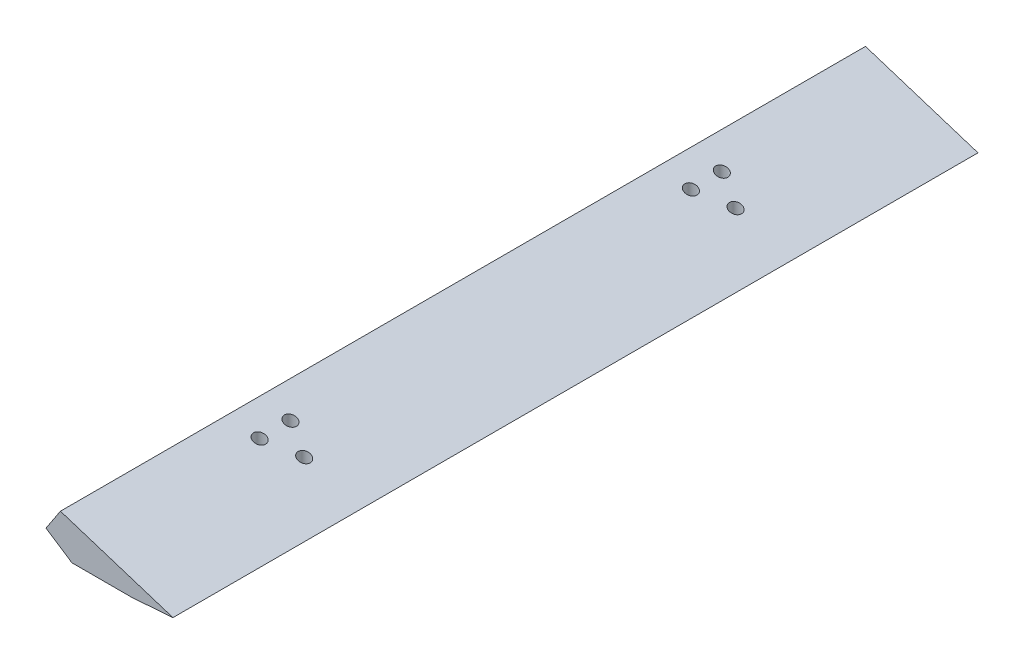
ISO-10303-21;
HEADER;
FILE_DESCRIPTION(('STEP AP214'),'2;1');
FILE_NAME('part.step','',(''),(''),'','','');
FILE_SCHEMA(('AUTOMOTIVE_DESIGN { 1 0 10303 214 1 1 1 1 }'));
ENDSEC;
DATA;
#1=APPLICATION_CONTEXT('core data for automotive mechanical design processes');
#2=APPLICATION_PROTOCOL_DEFINITION('international standard','automotive_design',2000,#1);
#3=PRODUCT_CONTEXT('',#1,'mechanical');
#4=PRODUCT('Part','Part','',(#3));
#5=PRODUCT_RELATED_PRODUCT_CATEGORY('part','',(#4));
#6=PRODUCT_DEFINITION_FORMATION('','',#4);
#7=PRODUCT_DEFINITION_CONTEXT('part definition',#1,'design');
#8=PRODUCT_DEFINITION('design','',#6,#7);
#9=PRODUCT_DEFINITION_SHAPE('','',#8);
#10=(LENGTH_UNIT() NAMED_UNIT(*) SI_UNIT(.MILLI.,.METRE.));
#11=(NAMED_UNIT(*) PLANE_ANGLE_UNIT() SI_UNIT($,.RADIAN.));
#12=(NAMED_UNIT(*) SI_UNIT($,.STERADIAN.) SOLID_ANGLE_UNIT());
#13=UNCERTAINTY_MEASURE_WITH_UNIT(LENGTH_MEASURE(1.E-05),#10,'distance_accuracy_value','');
#14=(GEOMETRIC_REPRESENTATION_CONTEXT(3) GLOBAL_UNCERTAINTY_ASSIGNED_CONTEXT((#13)) GLOBAL_UNIT_ASSIGNED_CONTEXT((#10,
#11,#12)) REPRESENTATION_CONTEXT('',''));
#15=CARTESIAN_POINT('',(0.,0.,0.));
#16=DIRECTION('',(0.,0.,1.));
#17=DIRECTION('',(1.,0.,0.));
#18=AXIS2_PLACEMENT_3D('',#15,#16,#17);
#19=CARTESIAN_POINT('',(17.6078131201036,0.755729128285601,100.));
#20=DIRECTION('',(-0.0745587241837779,0.997216624735111,0.));
#21=DIRECTION('',(-0.997216624735111,-0.0745587241837779,0.));
#22=AXIS2_PLACEMENT_3D('',#19,#20,#21);
#23=PLANE('',#22);
#24=DIRECTION('',(0.997216624735111,0.0745587241837779,0.));
#25=VECTOR('',#24,1.);
#26=CARTESIAN_POINT('',(17.6078131201036,0.755729128285601,-100.));
#27=LINE('',#26,#25);
#28=CARTESIAN_POINT('',(7.5,0.,-100.));
#29=VERTEX_POINT('',#28);
#30=CARTESIAN_POINT('',(17.6078131201036,0.755729128285601,-100.));
#31=VERTEX_POINT('',#30);
#32=EDGE_CURVE('E115',#29,#31,#27,.T.);
#33=ORIENTED_EDGE('',*,*,#32,.T.);
#34=DIRECTION('',(0.,0.,-1.));
#35=VECTOR('',#34,1.);
#36=CARTESIAN_POINT('',(17.6078131201036,0.755729128285601,100.));
#37=LINE('',#36,#35);
#38=CARTESIAN_POINT('',(17.6078131201036,0.755729128285601,100.));
#39=VERTEX_POINT('',#38);
#40=EDGE_CURVE('E11',#39,#31,#37,.T.);
#41=ORIENTED_EDGE('',*,*,#40,.F.);
#42=DIRECTION('',(0.997216624735111,0.0745587241837779,0.));
#43=VECTOR('',#42,1.);
#44=CARTESIAN_POINT('',(17.6078131201036,0.755729128285601,100.));
#45=LINE('',#44,#43);
#46=CARTESIAN_POINT('',(7.5,0.,100.));
#47=VERTEX_POINT('',#46);
#48=EDGE_CURVE('E124',#47,#39,#45,.T.);
#49=ORIENTED_EDGE('',*,*,#48,.F.);
#50=DIRECTION('',(0.,0.,-1.));
#51=VECTOR('',#50,1.);
#52=CARTESIAN_POINT('',(7.5,0.,100.));
#53=LINE('',#52,#51);
#54=EDGE_CURVE('E111',#47,#29,#53,.T.);
#55=ORIENTED_EDGE('',*,*,#54,.T.);
#56=EDGE_LOOP('',(#33,#41,#49,#55));
#57=FACE_BOUND('',#56,.T.);
#58=ADVANCED_FACE('F41',(#57),#23,.F.);
#59=CARTESIAN_POINT('',(-10.3429988633457,9.6800810846091,100.));
#60=DIRECTION('',(-0.304160187000519,-0.952620900801473,0.));
#61=DIRECTION('',(0.952620900801473,-0.304160187000519,0.));
#62=AXIS2_PLACEMENT_3D('',#59,#60,#61);
#63=PLANE('',#62);
#64=CARTESIAN_POINT('',(-3.45277858564504,7.48011813357896,57.4152980258553));
#65=DIRECTION('',(-0.304160187000519,-0.952620900801473,0.));
#66=DIRECTION('',(0.952620900801473,-0.304160187000519,0.));
#67=AXIS2_PLACEMENT_3D('',#64,#65,#66);
#68=ELLIPSE('',#67,1.5746032852502,1.5);
#69=CARTESIAN_POINT('',(-1.95277858564504,7.00118650388563,57.4152980258553));
#70=VERTEX_POINT('',#69);
#71=EDGE_CURVE('E119',#70,#70,#68,.T.);
#72=ORIENTED_EDGE('',*,*,#71,.T.);
#73=EDGE_LOOP('',(#72));
#74=FACE_BOUND('',#73,.T.);
#75=CARTESIAN_POINT('',(3.79404568461274,5.16629589500847,53.5789734553468));
#76=DIRECTION('',(-0.304160187000519,-0.952620900801473,0.));
#77=DIRECTION('',(0.952620900801473,-0.304160187000519,0.));
#78=AXIS2_PLACEMENT_3D('',#75,#76,#77);
#79=ELLIPSE('',#78,1.5746032852502,1.5);
#80=CARTESIAN_POINT('',(5.29404568461274,4.68736426531513,53.5789734553468));
#81=VERTEX_POINT('',#80);
#82=EDGE_CURVE('E163',#81,#81,#79,.T.);
#83=ORIENTED_EDGE('',*,*,#82,.T.);
#84=EDGE_LOOP('',(#83));
#85=FACE_BOUND('',#84,.T.);
#86=CARTESIAN_POINT('',(-3.45277858564504,7.48011813357896,49.7426488848383));
#87=DIRECTION('',(-0.304160187000519,-0.952620900801473,0.));
#88=DIRECTION('',(0.952620900801473,-0.304160187000519,0.));
#89=AXIS2_PLACEMENT_3D('',#86,#87,#88);
#90=ELLIPSE('',#89,1.5746032852502,1.5);
#91=CARTESIAN_POINT('',(-1.95277858564503,7.00118650388563,49.7426488848383));
#92=VERTEX_POINT('',#91);
#93=EDGE_CURVE('E167',#92,#92,#90,.T.);
#94=ORIENTED_EDGE('',*,*,#93,.T.);
#95=EDGE_LOOP('',(#94));
#96=FACE_BOUND('',#95,.T.);
#97=CARTESIAN_POINT('',(3.79404568461274,5.16629589500847,-53.5789734553468));
#98=DIRECTION('',(-0.304160187000519,-0.952620900801473,0.));
#99=DIRECTION('',(0.952620900801473,-0.304160187000519,0.));
#100=AXIS2_PLACEMENT_3D('',#97,#98,#99);
#101=ELLIPSE('',#100,1.5746032852502,1.5);
#102=CARTESIAN_POINT('',(5.29404568461274,4.68736426531513,-53.5789734553468));
#103=VERTEX_POINT('',#102);
#104=EDGE_CURVE('E171',#103,#103,#101,.T.);
#105=ORIENTED_EDGE('',*,*,#104,.T.);
#106=EDGE_LOOP('',(#105));
#107=FACE_BOUND('',#106,.T.);
#108=CARTESIAN_POINT('',(-3.45277858564504,7.48011813357896,-49.7426488848383));
#109=DIRECTION('',(-0.304160187000519,-0.952620900801473,0.));
#110=DIRECTION('',(0.952620900801473,-0.304160187000519,0.));
#111=AXIS2_PLACEMENT_3D('',#108,#109,#110);
#112=ELLIPSE('',#111,1.5746032852502,1.5);
#113=CARTESIAN_POINT('',(-1.95277858564504,7.00118650388563,-49.7426488848383));
#114=VERTEX_POINT('',#113);
#115=EDGE_CURVE('E175',#114,#114,#112,.T.);
#116=ORIENTED_EDGE('',*,*,#115,.T.);
#117=EDGE_LOOP('',(#116));
#118=FACE_BOUND('',#117,.T.);
#119=CARTESIAN_POINT('',(-3.45277858564504,7.48011813357896,-57.4152980258553));
#120=DIRECTION('',(-0.304160187000519,-0.952620900801473,0.));
#121=DIRECTION('',(0.952620900801473,-0.304160187000519,0.));
#122=AXIS2_PLACEMENT_3D('',#119,#120,#121);
#123=ELLIPSE('',#122,1.5746032852502,1.5);
#124=CARTESIAN_POINT('',(-1.95277858564503,7.00118650388563,-57.4152980258553));
#125=VERTEX_POINT('',#124);
#126=EDGE_CURVE('E178',#125,#125,#123,.T.);
#127=ORIENTED_EDGE('',*,*,#126,.T.);
#128=EDGE_LOOP('',(#127));
#129=FACE_BOUND('',#128,.T.);
#130=DIRECTION('',(-0.952620900801473,0.304160187000519,0.));
#131=VECTOR('',#130,1.);
#132=CARTESIAN_POINT('',(-10.3429988633457,9.6800810846091,-100.));
#133=LINE('',#132,#131);
#134=CARTESIAN_POINT('',(-10.3429988633457,9.6800810846091,-100.));
#135=VERTEX_POINT('',#134);
#136=EDGE_CURVE('E118',#31,#135,#133,.T.);
#137=ORIENTED_EDGE('',*,*,#136,.T.);
#138=DIRECTION('',(0.,0.,-1.));
#139=VECTOR('',#138,1.);
#140=CARTESIAN_POINT('',(-10.3429988633457,9.6800810846091,100.));
#141=LINE('',#140,#139);
#142=CARTESIAN_POINT('',(-10.3429988633457,9.6800810846091,100.));
#143=VERTEX_POINT('',#142);
#144=EDGE_CURVE('E49',#143,#135,#141,.T.);
#145=ORIENTED_EDGE('',*,*,#144,.F.);
#146=DIRECTION('',(-0.952620900801473,0.304160187000519,0.));
#147=VECTOR('',#146,1.);
#148=CARTESIAN_POINT('',(-10.3429988633457,9.6800810846091,100.));
#149=LINE('',#148,#147);
#150=EDGE_CURVE('E91',#39,#143,#149,.T.);
#151=ORIENTED_EDGE('',*,*,#150,.F.);
#152=ORIENTED_EDGE('',*,*,#40,.T.);
#153=EDGE_LOOP('',(#137,#145,#151,#152));
#154=FACE_BOUND('',#153,.T.);
#155=ADVANCED_FACE('F148',(#74,#85,#96,#107,#118,#129,#154),#63,.F.);
#156=CARTESIAN_POINT('',(-13.9309641666799,4.24681532864706,100.));
#157=DIRECTION('',(0.834467461887464,-0.551057215769011,0.));
#158=DIRECTION('',(0.551057215769011,0.834467461887464,0.));
#159=AXIS2_PLACEMENT_3D('',#156,#157,#158);
#160=PLANE('',#159);
#161=DIRECTION('',(-0.551057215769011,-0.834467461887464,0.));
#162=VECTOR('',#161,1.);
#163=CARTESIAN_POINT('',(-13.9309641666799,4.24681532864706,-100.));
#164=LINE('',#163,#162);
#165=CARTESIAN_POINT('',(-13.9309641666799,4.24681532864706,-100.));
#166=VERTEX_POINT('',#165);
#167=EDGE_CURVE('E106',#135,#166,#164,.T.);
#168=ORIENTED_EDGE('',*,*,#167,.T.);
#169=DIRECTION('',(0.,0.,-1.));
#170=VECTOR('',#169,1.);
#171=CARTESIAN_POINT('',(-13.9309641666799,4.24681532864706,100.));
#172=LINE('',#171,#170);
#173=CARTESIAN_POINT('',(-13.9309641666799,4.24681532864706,100.));
#174=VERTEX_POINT('',#173);
#175=EDGE_CURVE('E103',#174,#166,#172,.T.);
#176=ORIENTED_EDGE('',*,*,#175,.F.);
#177=DIRECTION('',(-0.551057215769011,-0.834467461887464,0.));
#178=VECTOR('',#177,1.);
#179=CARTESIAN_POINT('',(-13.9309641666799,4.24681532864706,100.));
#180=LINE('',#179,#178);
#181=EDGE_CURVE('E95',#143,#174,#180,.T.);
#182=ORIENTED_EDGE('',*,*,#181,.F.);
#183=ORIENTED_EDGE('',*,*,#144,.T.);
#184=EDGE_LOOP('',(#168,#176,#182,#183));
#185=FACE_BOUND('',#184,.T.);
#186=ADVANCED_FACE('F104',(#185),#160,.F.);
#187=CARTESIAN_POINT('',(-7.5,0.,100.));
#188=DIRECTION('',(0.55105721576901,0.834467461887464,0.));
#189=DIRECTION('',(-0.834467461887464,0.55105721576901,0.));
#190=AXIS2_PLACEMENT_3D('',#187,#188,#189);
#191=PLANE('',#190);
#192=DIRECTION('',(0.834467461887464,-0.55105721576901,0.));
#193=VECTOR('',#192,1.);
#194=CARTESIAN_POINT('',(-7.5,0.,-100.));
#195=LINE('',#194,#193);
#196=CARTESIAN_POINT('',(-7.5,0.,-100.));
#197=VERTEX_POINT('',#196);
#198=EDGE_CURVE('E77',#166,#197,#195,.T.);
#199=ORIENTED_EDGE('',*,*,#198,.T.);
#200=DIRECTION('',(0.,0.,-1.));
#201=VECTOR('',#200,1.);
#202=CARTESIAN_POINT('',(-7.5,0.,100.));
#203=LINE('',#202,#201);
#204=CARTESIAN_POINT('',(-7.5,0.,100.));
#205=VERTEX_POINT('',#204);
#206=EDGE_CURVE('E107',#205,#197,#203,.T.);
#207=ORIENTED_EDGE('',*,*,#206,.F.);
#208=DIRECTION('',(0.834467461887464,-0.55105721576901,0.));
#209=VECTOR('',#208,1.);
#210=CARTESIAN_POINT('',(-7.5,0.,100.));
#211=LINE('',#210,#209);
#212=EDGE_CURVE('E99',#174,#205,#211,.T.);
#213=ORIENTED_EDGE('',*,*,#212,.F.);
#214=ORIENTED_EDGE('',*,*,#175,.T.);
#215=EDGE_LOOP('',(#199,#207,#213,#214));
#216=FACE_BOUND('',#215,.T.);
#217=ADVANCED_FACE('F109',(#216),#191,.F.);
#218=CARTESIAN_POINT('',(-7.5,0.,100.));
#219=DIRECTION('',(0.,1.,0.));
#220=DIRECTION('',(0.,0.,1.));
#221=AXIS2_PLACEMENT_3D('',#218,#219,#220);
#222=PLANE('',#221);
#223=CARTESIAN_POINT('',(-3.45277858564504,0.,57.4152980258553));
#224=DIRECTION('',(0.,-1.,0.));
#225=DIRECTION('',(0.,0.,-1.));
#226=AXIS2_PLACEMENT_3D('',#223,#224,#225);
#227=CIRCLE('',#226,1.5);
#228=CARTESIAN_POINT('',(-3.45277858564504,0.,55.9152980258553));
#229=VERTEX_POINT('',#228);
#230=EDGE_CURVE('E180',#229,#229,#227,.T.);
#231=ORIENTED_EDGE('',*,*,#230,.F.);
#232=EDGE_LOOP('',(#231));
#233=FACE_BOUND('',#232,.T.);
#234=CARTESIAN_POINT('',(3.79404568461274,0.,53.5789734553468));
#235=DIRECTION('',(0.,-1.,0.));
#236=DIRECTION('',(0.,0.,-1.));
#237=AXIS2_PLACEMENT_3D('',#234,#235,#236);
#238=CIRCLE('',#237,1.5);
#239=CARTESIAN_POINT('',(3.79404568461274,0.,52.0789734553468));
#240=VERTEX_POINT('',#239);
#241=EDGE_CURVE('E184',#240,#240,#238,.T.);
#242=ORIENTED_EDGE('',*,*,#241,.F.);
#243=EDGE_LOOP('',(#242));
#244=FACE_BOUND('',#243,.T.);
#245=CARTESIAN_POINT('',(-3.45277858564504,0.,49.7426488848383));
#246=DIRECTION('',(0.,-1.,0.));
#247=DIRECTION('',(0.,0.,-1.));
#248=AXIS2_PLACEMENT_3D('',#245,#246,#247);
#249=CIRCLE('',#248,1.5);
#250=CARTESIAN_POINT('',(-3.45277858564504,0.,48.2426488848383));
#251=VERTEX_POINT('',#250);
#252=EDGE_CURVE('E201',#251,#251,#249,.T.);
#253=ORIENTED_EDGE('',*,*,#252,.F.);
#254=EDGE_LOOP('',(#253));
#255=FACE_BOUND('',#254,.T.);
#256=CARTESIAN_POINT('',(3.79404568461274,0.,-53.5789734553468));
#257=DIRECTION('',(0.,-1.,0.));
#258=DIRECTION('',(0.,0.,-1.));
#259=AXIS2_PLACEMENT_3D('',#256,#257,#258);
#260=CIRCLE('',#259,1.5);
#261=CARTESIAN_POINT('',(3.79404568461274,0.,-55.0789734553468));
#262=VERTEX_POINT('',#261);
#263=EDGE_CURVE('E198',#262,#262,#260,.T.);
#264=ORIENTED_EDGE('',*,*,#263,.F.);
#265=EDGE_LOOP('',(#264));
#266=FACE_BOUND('',#265,.T.);
#267=CARTESIAN_POINT('',(-3.45277858564504,0.,-49.7426488848383));
#268=DIRECTION('',(0.,-1.,0.));
#269=DIRECTION('',(0.,0.,-1.));
#270=AXIS2_PLACEMENT_3D('',#267,#268,#269);
#271=CIRCLE('',#270,1.5);
#272=CARTESIAN_POINT('',(-3.45277858564504,0.,-51.2426488848383));
#273=VERTEX_POINT('',#272);
#274=EDGE_CURVE('E195',#273,#273,#271,.T.);
#275=ORIENTED_EDGE('',*,*,#274,.F.);
#276=EDGE_LOOP('',(#275));
#277=FACE_BOUND('',#276,.T.);
#278=CARTESIAN_POINT('',(-3.45277858564504,0.,-57.4152980258553));
#279=DIRECTION('',(0.,-1.,0.));
#280=DIRECTION('',(0.,0.,-1.));
#281=AXIS2_PLACEMENT_3D('',#278,#279,#280);
#282=CIRCLE('',#281,1.5);
#283=CARTESIAN_POINT('',(-3.45277858564504,0.,-58.9152980258553));
#284=VERTEX_POINT('',#283);
#285=EDGE_CURVE('E187',#284,#284,#282,.T.);
#286=ORIENTED_EDGE('',*,*,#285,.F.);
#287=EDGE_LOOP('',(#286));
#288=FACE_BOUND('',#287,.T.);
#289=DIRECTION('',(1.,0.,0.));
#290=VECTOR('',#289,1.);
#291=CARTESIAN_POINT('',(-7.5,0.,-100.));
#292=LINE('',#291,#290);
#293=EDGE_CURVE('E83',#197,#29,#292,.T.);
#294=ORIENTED_EDGE('',*,*,#293,.T.);
#295=ORIENTED_EDGE('',*,*,#54,.F.);
#296=DIRECTION('',(1.,0.,0.));
#297=VECTOR('',#296,1.);
#298=CARTESIAN_POINT('',(-7.5,0.,100.));
#299=LINE('',#298,#297);
#300=EDGE_CURVE('E57',#205,#47,#299,.T.);
#301=ORIENTED_EDGE('',*,*,#300,.F.);
#302=ORIENTED_EDGE('',*,*,#206,.T.);
#303=EDGE_LOOP('',(#294,#295,#301,#302));
#304=FACE_BOUND('',#303,.T.);
#305=ADVANCED_FACE('F132',(#233,#244,#255,#266,#277,#288,#304),#222,.F.);
#306=CARTESIAN_POINT('',(0.,0.,100.));
#307=DIRECTION('',(0.,0.,-1.));
#308=DIRECTION('',(-1.,0.,0.));
#309=AXIS2_PLACEMENT_3D('',#306,#307,#308);
#310=PLANE('',#309);
#311=ORIENTED_EDGE('',*,*,#48,.T.);
#312=ORIENTED_EDGE('',*,*,#150,.T.);
#313=ORIENTED_EDGE('',*,*,#181,.T.);
#314=ORIENTED_EDGE('',*,*,#212,.T.);
#315=ORIENTED_EDGE('',*,*,#300,.T.);
#316=EDGE_LOOP('',(#311,#312,#313,#314,#315));
#317=FACE_BOUND('',#316,.T.);
#318=ADVANCED_FACE('F97',(#317),#310,.F.);
#319=CARTESIAN_POINT('',(0.,0.,-100.));
#320=DIRECTION('',(0.,0.,-1.));
#321=DIRECTION('',(-1.,0.,0.));
#322=AXIS2_PLACEMENT_3D('',#319,#320,#321);
#323=PLANE('',#322);
#324=ORIENTED_EDGE('',*,*,#32,.F.);
#325=ORIENTED_EDGE('',*,*,#293,.F.);
#326=ORIENTED_EDGE('',*,*,#198,.F.);
#327=ORIENTED_EDGE('',*,*,#167,.F.);
#328=ORIENTED_EDGE('',*,*,#136,.F.);
#329=EDGE_LOOP('',(#324,#325,#326,#327,#328));
#330=FACE_BOUND('',#329,.T.);
#331=ADVANCED_FACE('F128',(#330),#323,.T.);
#332=CARTESIAN_POINT('',(-3.45277858564504,9.6800810846091,-57.4152980258553));
#333=DIRECTION('',(0.,-1.,0.));
#334=DIRECTION('',(0.,0.,-1.));
#335=AXIS2_PLACEMENT_3D('',#332,#333,#334);
#336=CYLINDRICAL_SURFACE('',#335,1.5);
#337=ORIENTED_EDGE('',*,*,#285,.T.);
#338=EDGE_LOOP('',(#337));
#339=FACE_BOUND('',#338,.T.);
#340=ORIENTED_EDGE('',*,*,#126,.F.);
#341=EDGE_LOOP('',(#340));
#342=FACE_BOUND('',#341,.T.);
#343=ADVANCED_FACE('F218',(#339,#342),#336,.F.);
#344=CARTESIAN_POINT('',(-3.45277858564504,9.6800810846091,-49.7426488848383));
#345=DIRECTION('',(0.,-1.,0.));
#346=DIRECTION('',(0.,0.,-1.));
#347=AXIS2_PLACEMENT_3D('',#344,#345,#346);
#348=CYLINDRICAL_SURFACE('',#347,1.5);
#349=ORIENTED_EDGE('',*,*,#274,.T.);
#350=EDGE_LOOP('',(#349));
#351=FACE_BOUND('',#350,.T.);
#352=ORIENTED_EDGE('',*,*,#115,.F.);
#353=EDGE_LOOP('',(#352));
#354=FACE_BOUND('',#353,.T.);
#355=ADVANCED_FACE('F219',(#351,#354),#348,.F.);
#356=CARTESIAN_POINT('',(3.79404568461274,9.6800810846091,-53.5789734553468));
#357=DIRECTION('',(0.,-1.,0.));
#358=DIRECTION('',(0.,0.,-1.));
#359=AXIS2_PLACEMENT_3D('',#356,#357,#358);
#360=CYLINDRICAL_SURFACE('',#359,1.5);
#361=ORIENTED_EDGE('',*,*,#263,.T.);
#362=EDGE_LOOP('',(#361));
#363=FACE_BOUND('',#362,.T.);
#364=ORIENTED_EDGE('',*,*,#104,.F.);
#365=EDGE_LOOP('',(#364));
#366=FACE_BOUND('',#365,.T.);
#367=ADVANCED_FACE('F224',(#363,#366),#360,.F.);
#368=CARTESIAN_POINT('',(-3.45277858564504,9.6800810846091,49.7426488848383));
#369=DIRECTION('',(0.,-1.,0.));
#370=DIRECTION('',(0.,0.,-1.));
#371=AXIS2_PLACEMENT_3D('',#368,#369,#370);
#372=CYLINDRICAL_SURFACE('',#371,1.5);
#373=ORIENTED_EDGE('',*,*,#252,.T.);
#374=EDGE_LOOP('',(#373));
#375=FACE_BOUND('',#374,.T.);
#376=ORIENTED_EDGE('',*,*,#93,.F.);
#377=EDGE_LOOP('',(#376));
#378=FACE_BOUND('',#377,.T.);
#379=ADVANCED_FACE('F230',(#375,#378),#372,.F.);
#380=CARTESIAN_POINT('',(3.79404568461274,9.6800810846091,53.5789734553468));
#381=DIRECTION('',(0.,-1.,0.));
#382=DIRECTION('',(0.,0.,-1.));
#383=AXIS2_PLACEMENT_3D('',#380,#381,#382);
#384=CYLINDRICAL_SURFACE('',#383,1.5);
#385=ORIENTED_EDGE('',*,*,#241,.T.);
#386=EDGE_LOOP('',(#385));
#387=FACE_BOUND('',#386,.T.);
#388=ORIENTED_EDGE('',*,*,#82,.F.);
#389=EDGE_LOOP('',(#388));
#390=FACE_BOUND('',#389,.T.);
#391=ADVANCED_FACE('F207',(#387,#390),#384,.F.);
#392=CARTESIAN_POINT('',(-3.45277858564504,9.6800810846091,57.4152980258553));
#393=DIRECTION('',(0.,-1.,0.));
#394=DIRECTION('',(0.,0.,-1.));
#395=AXIS2_PLACEMENT_3D('',#392,#393,#394);
#396=CYLINDRICAL_SURFACE('',#395,1.5);
#397=ORIENTED_EDGE('',*,*,#230,.T.);
#398=EDGE_LOOP('',(#397));
#399=FACE_BOUND('',#398,.T.);
#400=ORIENTED_EDGE('',*,*,#71,.F.);
#401=EDGE_LOOP('',(#400));
#402=FACE_BOUND('',#401,.T.);
#403=ADVANCED_FACE('F237',(#399,#402),#396,.F.);
#404=CLOSED_SHELL('',(#58,#155,#186,#217,#305,#318,#331,#343,#355,#367,#379,#391,#403));
#405=MANIFOLD_SOLID_BREP('B2',#404);
#406=ADVANCED_BREP_SHAPE_REPRESENTATION('',(#18,#405),#14);
#407=SHAPE_DEFINITION_REPRESENTATION(#9,#406);
ENDSEC;
END-ISO-10303-21;
